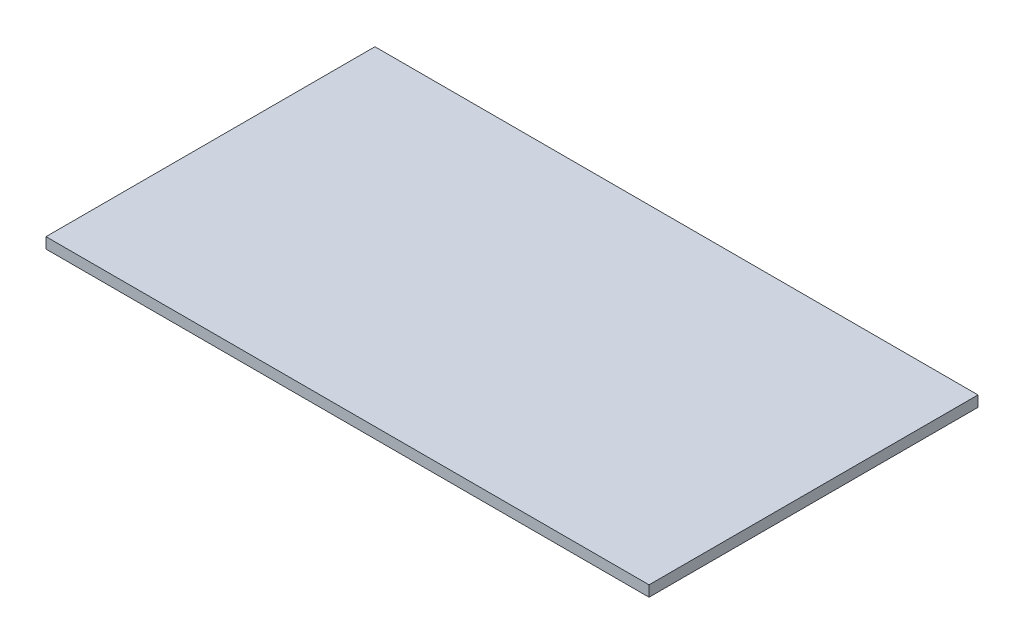
ISO-10303-21;
HEADER;
FILE_DESCRIPTION(('STEP AP214'),'2;1');
FILE_NAME('part.step','',(''),(''),'','','');
FILE_SCHEMA(('AUTOMOTIVE_DESIGN { 1 0 10303 214 1 1 1 1 }'));
ENDSEC;
DATA;
#1=APPLICATION_CONTEXT('core data for automotive mechanical design processes');
#2=APPLICATION_PROTOCOL_DEFINITION('international standard','automotive_design',2000,#1);
#3=PRODUCT_CONTEXT('',#1,'mechanical');
#4=PRODUCT('Part','Part','',(#3));
#5=PRODUCT_RELATED_PRODUCT_CATEGORY('part','',(#4));
#6=PRODUCT_DEFINITION_FORMATION('','',#4);
#7=PRODUCT_DEFINITION_CONTEXT('part definition',#1,'design');
#8=PRODUCT_DEFINITION('design','',#6,#7);
#9=PRODUCT_DEFINITION_SHAPE('','',#8);
#10=(LENGTH_UNIT() NAMED_UNIT(*) SI_UNIT(.MILLI.,.METRE.));
#11=(NAMED_UNIT(*) PLANE_ANGLE_UNIT() SI_UNIT($,.RADIAN.));
#12=(NAMED_UNIT(*) SI_UNIT($,.STERADIAN.) SOLID_ANGLE_UNIT());
#13=UNCERTAINTY_MEASURE_WITH_UNIT(LENGTH_MEASURE(1.E-05),#10,'distance_accuracy_value','');
#14=(GEOMETRIC_REPRESENTATION_CONTEXT(3) GLOBAL_UNCERTAINTY_ASSIGNED_CONTEXT((#13)) GLOBAL_UNIT_ASSIGNED_CONTEXT((#10,
#11,#12)) REPRESENTATION_CONTEXT('',''));
#15=CARTESIAN_POINT('',(0.,0.,0.));
#16=DIRECTION('',(0.,0.,1.));
#17=DIRECTION('',(1.,0.,0.));
#18=AXIS2_PLACEMENT_3D('',#15,#16,#17);
#19=CARTESIAN_POINT('',(279.4,10.,-152.4));
#20=DIRECTION('',(-1.,0.,0.));
#21=DIRECTION('',(0.,0.,1.));
#22=AXIS2_PLACEMENT_3D('',#19,#20,#21);
#23=PLANE('',#22);
#24=DIRECTION('',(0.,0.,-1.));
#25=VECTOR('',#24,1.);
#26=CARTESIAN_POINT('',(279.4,0.,-152.4));
#27=LINE('',#26,#25);
#28=CARTESIAN_POINT('',(279.4,0.,152.4));
#29=VERTEX_POINT('',#28);
#30=CARTESIAN_POINT('',(279.4,0.,-152.4));
#31=VERTEX_POINT('',#30);
#32=EDGE_CURVE('E95',#29,#31,#27,.T.);
#33=ORIENTED_EDGE('',*,*,#32,.T.);
#34=DIRECTION('',(0.,-1.,0.));
#35=VECTOR('',#34,1.);
#36=CARTESIAN_POINT('',(279.4,10.,-152.4));
#37=LINE('',#36,#35);
#38=CARTESIAN_POINT('',(279.4,10.,-152.4));
#39=VERTEX_POINT('',#38);
#40=EDGE_CURVE('E11',#39,#31,#37,.T.);
#41=ORIENTED_EDGE('',*,*,#40,.F.);
#42=DIRECTION('',(0.,0.,-1.));
#43=VECTOR('',#42,1.);
#44=CARTESIAN_POINT('',(279.4,10.,-152.4));
#45=LINE('',#44,#43);
#46=CARTESIAN_POINT('',(279.4,10.,152.4));
#47=VERTEX_POINT('',#46);
#48=EDGE_CURVE('E83',#47,#39,#45,.T.);
#49=ORIENTED_EDGE('',*,*,#48,.F.);
#50=DIRECTION('',(0.,-1.,0.));
#51=VECTOR('',#50,1.);
#52=CARTESIAN_POINT('',(279.4,10.,152.4));
#53=LINE('',#52,#51);
#54=EDGE_CURVE('E91',#47,#29,#53,.T.);
#55=ORIENTED_EDGE('',*,*,#54,.T.);
#56=EDGE_LOOP('',(#33,#41,#49,#55));
#57=FACE_BOUND('',#56,.T.);
#58=ADVANCED_FACE('F32',(#57),#23,.F.);
#59=CARTESIAN_POINT('',(-279.4,10.,-152.4));
#60=DIRECTION('',(0.,0.,1.));
#61=DIRECTION('',(1.,0.,0.));
#62=AXIS2_PLACEMENT_3D('',#59,#60,#61);
#63=PLANE('',#62);
#64=DIRECTION('',(-1.,0.,0.));
#65=VECTOR('',#64,1.);
#66=CARTESIAN_POINT('',(-279.4,0.,-152.4));
#67=LINE('',#66,#65);
#68=CARTESIAN_POINT('',(-279.4,0.,-152.4));
#69=VERTEX_POINT('',#68);
#70=EDGE_CURVE('E87',#31,#69,#67,.T.);
#71=ORIENTED_EDGE('',*,*,#70,.T.);
#72=DIRECTION('',(0.,-1.,0.));
#73=VECTOR('',#72,1.);
#74=CARTESIAN_POINT('',(-279.4,10.,-152.4));
#75=LINE('',#74,#73);
#76=CARTESIAN_POINT('',(-279.4,10.,-152.4));
#77=VERTEX_POINT('',#76);
#78=EDGE_CURVE('E40',#77,#69,#75,.T.);
#79=ORIENTED_EDGE('',*,*,#78,.F.);
#80=DIRECTION('',(-1.,0.,0.));
#81=VECTOR('',#80,1.);
#82=CARTESIAN_POINT('',(-279.4,10.,-152.4));
#83=LINE('',#82,#81);
#84=EDGE_CURVE('E78',#39,#77,#83,.T.);
#85=ORIENTED_EDGE('',*,*,#84,.F.);
#86=ORIENTED_EDGE('',*,*,#40,.T.);
#87=EDGE_LOOP('',(#71,#79,#85,#86));
#88=FACE_BOUND('',#87,.T.);
#89=ADVANCED_FACE('F86',(#88),#63,.F.);
#90=CARTESIAN_POINT('',(-279.4,10.,-152.4));
#91=DIRECTION('',(1.,0.,0.));
#92=DIRECTION('',(0.,0.,-1.));
#93=AXIS2_PLACEMENT_3D('',#90,#91,#92);
#94=PLANE('',#93);
#95=DIRECTION('',(0.,0.,1.));
#96=VECTOR('',#95,1.);
#97=CARTESIAN_POINT('',(-279.4,0.,-152.4));
#98=LINE('',#97,#96);
#99=CARTESIAN_POINT('',(-279.4,0.,152.4));
#100=VERTEX_POINT('',#99);
#101=EDGE_CURVE('E65',#69,#100,#98,.T.);
#102=ORIENTED_EDGE('',*,*,#101,.T.);
#103=DIRECTION('',(0.,-1.,0.));
#104=VECTOR('',#103,1.);
#105=CARTESIAN_POINT('',(-279.4,10.,152.4));
#106=LINE('',#105,#104);
#107=CARTESIAN_POINT('',(-279.4,10.,152.4));
#108=VERTEX_POINT('',#107);
#109=EDGE_CURVE('E88',#108,#100,#106,.T.);
#110=ORIENTED_EDGE('',*,*,#109,.F.);
#111=DIRECTION('',(0.,0.,1.));
#112=VECTOR('',#111,1.);
#113=CARTESIAN_POINT('',(-279.4,10.,-152.4));
#114=LINE('',#113,#112);
#115=EDGE_CURVE('E81',#77,#108,#114,.T.);
#116=ORIENTED_EDGE('',*,*,#115,.F.);
#117=ORIENTED_EDGE('',*,*,#78,.T.);
#118=EDGE_LOOP('',(#102,#110,#116,#117));
#119=FACE_BOUND('',#118,.T.);
#120=ADVANCED_FACE('F89',(#119),#94,.F.);
#121=CARTESIAN_POINT('',(-279.4,10.,152.4));
#122=DIRECTION('',(0.,0.,-1.));
#123=DIRECTION('',(-1.,0.,0.));
#124=AXIS2_PLACEMENT_3D('',#121,#122,#123);
#125=PLANE('',#124);
#126=DIRECTION('',(1.,0.,0.));
#127=VECTOR('',#126,1.);
#128=CARTESIAN_POINT('',(-279.4,0.,152.4));
#129=LINE('',#128,#127);
#130=EDGE_CURVE('E71',#100,#29,#129,.T.);
#131=ORIENTED_EDGE('',*,*,#130,.T.);
#132=ORIENTED_EDGE('',*,*,#54,.F.);
#133=DIRECTION('',(1.,0.,0.));
#134=VECTOR('',#133,1.);
#135=CARTESIAN_POINT('',(-279.4,10.,152.4));
#136=LINE('',#135,#134);
#137=EDGE_CURVE('E48',#108,#47,#136,.T.);
#138=ORIENTED_EDGE('',*,*,#137,.F.);
#139=ORIENTED_EDGE('',*,*,#109,.T.);
#140=EDGE_LOOP('',(#131,#132,#138,#139));
#141=FACE_BOUND('',#140,.T.);
#142=ADVANCED_FACE('F102',(#141),#125,.F.);
#143=CARTESIAN_POINT('',(0.,10.,0.));
#144=DIRECTION('',(0.,1.,0.));
#145=DIRECTION('',(0.,0.,1.));
#146=AXIS2_PLACEMENT_3D('',#143,#144,#145);
#147=PLANE('',#146);
#148=ORIENTED_EDGE('',*,*,#48,.T.);
#149=ORIENTED_EDGE('',*,*,#84,.T.);
#150=ORIENTED_EDGE('',*,*,#115,.T.);
#151=ORIENTED_EDGE('',*,*,#137,.T.);
#152=EDGE_LOOP('',(#148,#149,#150,#151));
#153=FACE_BOUND('',#152,.T.);
#154=ADVANCED_FACE('F79',(#153),#147,.T.);
#155=CARTESIAN_POINT('',(0.,0.,0.));
#156=DIRECTION('',(0.,1.,0.));
#157=DIRECTION('',(0.,0.,1.));
#158=AXIS2_PLACEMENT_3D('',#155,#156,#157);
#159=PLANE('',#158);
#160=ORIENTED_EDGE('',*,*,#32,.F.);
#161=ORIENTED_EDGE('',*,*,#130,.F.);
#162=ORIENTED_EDGE('',*,*,#101,.F.);
#163=ORIENTED_EDGE('',*,*,#70,.F.);
#164=EDGE_LOOP('',(#160,#161,#162,#163));
#165=FACE_BOUND('',#164,.T.);
#166=ADVANCED_FACE('F105',(#165),#159,.F.);
#167=CLOSED_SHELL('',(#58,#89,#120,#142,#154,#166));
#168=MANIFOLD_SOLID_BREP('B2',#167);
#169=ADVANCED_BREP_SHAPE_REPRESENTATION('',(#18,#168),#14);
#170=SHAPE_DEFINITION_REPRESENTATION(#9,#169);
ENDSEC;
END-ISO-10303-21;
